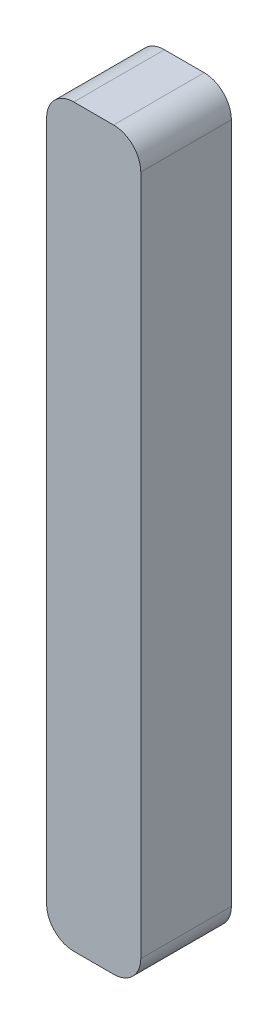
ISO-10303-21;
HEADER;
FILE_DESCRIPTION(('STEP AP214'),'2;1');
FILE_NAME('part.step','',(''),(''),'','','');
FILE_SCHEMA(('AUTOMOTIVE_DESIGN { 1 0 10303 214 1 1 1 1 }'));
ENDSEC;
DATA;
#1=APPLICATION_CONTEXT('core data for automotive mechanical design processes');
#2=APPLICATION_PROTOCOL_DEFINITION('international standard','automotive_design',2000,#1);
#3=PRODUCT_CONTEXT('',#1,'mechanical');
#4=PRODUCT('Part','Part','',(#3));
#5=PRODUCT_RELATED_PRODUCT_CATEGORY('part','',(#4));
#6=PRODUCT_DEFINITION_FORMATION('','',#4);
#7=PRODUCT_DEFINITION_CONTEXT('part definition',#1,'design');
#8=PRODUCT_DEFINITION('design','',#6,#7);
#9=PRODUCT_DEFINITION_SHAPE('','',#8);
#10=(LENGTH_UNIT() NAMED_UNIT(*) SI_UNIT(.MILLI.,.METRE.));
#11=(NAMED_UNIT(*) PLANE_ANGLE_UNIT() SI_UNIT($,.RADIAN.));
#12=(NAMED_UNIT(*) SI_UNIT($,.STERADIAN.) SOLID_ANGLE_UNIT());
#13=UNCERTAINTY_MEASURE_WITH_UNIT(LENGTH_MEASURE(1.E-05),#10,'distance_accuracy_value','');
#14=(GEOMETRIC_REPRESENTATION_CONTEXT(3) GLOBAL_UNCERTAINTY_ASSIGNED_CONTEXT((#13)) GLOBAL_UNIT_ASSIGNED_CONTEXT((#10,
#11,#12)) REPRESENTATION_CONTEXT('',''));
#15=CARTESIAN_POINT('',(0.,0.,0.));
#16=DIRECTION('',(0.,0.,1.));
#17=DIRECTION('',(1.,0.,0.));
#18=AXIS2_PLACEMENT_3D('',#15,#16,#17);
#19=CARTESIAN_POINT('',(-0.364922069394,-0.226124125005,0.));
#20=DIRECTION('',(0.,0.,1.));
#21=DIRECTION('',(1.,0.,0.));
#22=AXIS2_PLACEMENT_3D('',#19,#20,#21);
#23=PLANE('',#22);
#24=CARTESIAN_POINT('',(-0.342950473699,0.149841895363,0.));
#25=DIRECTION('',(0.,0.,1.));
#26=DIRECTION('',(0.707106781186548,0.707106781186548,0.));
#27=AXIS2_PLACEMENT_3D('',#24,#25,#26);
#28=CIRCLE('',#27,0.03);
#29=CARTESIAN_POINT('',(-0.312950473699,0.149841895363,0.));
#30=VERTEX_POINT('',#29);
#31=CARTESIAN_POINT('',(-0.342950473699,0.179841895363,0.));
#32=VERTEX_POINT('',#31);
#33=EDGE_CURVE('E165',#30,#32,#28,.T.);
#34=ORIENTED_EDGE('',*,*,#33,.F.);
#35=DIRECTION('',(0.,1.,0.));
#36=VECTOR('',#35,1.);
#37=CARTESIAN_POINT('',(-0.312950473699,-0.632090145373,0.));
#38=LINE('',#37,#36);
#39=CARTESIAN_POINT('',(-0.312950473699,-0.602090145373,0.));
#40=VERTEX_POINT('',#39);
#41=EDGE_CURVE('E11',#40,#30,#38,.T.);
#42=ORIENTED_EDGE('',*,*,#41,.F.);
#43=CARTESIAN_POINT('',(-0.342950473699,-0.602090145373,0.));
#44=DIRECTION('',(0.,0.,1.));
#45=DIRECTION('',(0.707106781186548,-0.707106781186548,0.));
#46=AXIS2_PLACEMENT_3D('',#43,#44,#45);
#47=CIRCLE('',#46,0.03);
#48=CARTESIAN_POINT('',(-0.342950473699,-0.632090145373,0.));
#49=VERTEX_POINT('',#48);
#50=EDGE_CURVE('E108',#49,#40,#47,.T.);
#51=ORIENTED_EDGE('',*,*,#50,.F.);
#52=DIRECTION('',(1.,0.,0.));
#53=VECTOR('',#52,1.);
#54=CARTESIAN_POINT('',(-0.416893665089,-0.632090145373,0.));
#55=LINE('',#54,#53);
#56=CARTESIAN_POINT('',(-0.386893665089,-0.632090145373,0.));
#57=VERTEX_POINT('',#56);
#58=EDGE_CURVE('E100',#57,#49,#55,.T.);
#59=ORIENTED_EDGE('',*,*,#58,.F.);
#60=CARTESIAN_POINT('',(-0.386893665089,-0.602090145373,0.));
#61=DIRECTION('',(0.,0.,1.));
#62=DIRECTION('',(-0.707106781186548,-0.707106781186548,0.));
#63=AXIS2_PLACEMENT_3D('',#60,#61,#62);
#64=CIRCLE('',#63,0.03);
#65=CARTESIAN_POINT('',(-0.416893665089,-0.602090145373,0.));
#66=VERTEX_POINT('',#65);
#67=EDGE_CURVE('E139',#66,#57,#64,.T.);
#68=ORIENTED_EDGE('',*,*,#67,.F.);
#69=DIRECTION('',(0.,-1.,0.));
#70=VECTOR('',#69,1.);
#71=CARTESIAN_POINT('',(-0.416893665089,0.179841895363,0.));
#72=LINE('',#71,#70);
#73=CARTESIAN_POINT('',(-0.416893665089,0.149841895363,0.));
#74=VERTEX_POINT('',#73);
#75=EDGE_CURVE('E27',#74,#66,#72,.T.);
#76=ORIENTED_EDGE('',*,*,#75,.F.);
#77=CARTESIAN_POINT('',(-0.386893665089,0.149841895363,0.));
#78=DIRECTION('',(0.,0.,1.));
#79=DIRECTION('',(-0.707106781186548,0.707106781186548,0.));
#80=AXIS2_PLACEMENT_3D('',#77,#78,#79);
#81=CIRCLE('',#80,0.03);
#82=CARTESIAN_POINT('',(-0.386893665089,0.179841895363,0.));
#83=VERTEX_POINT('',#82);
#84=EDGE_CURVE('E126',#83,#74,#81,.T.);
#85=ORIENTED_EDGE('',*,*,#84,.F.);
#86=DIRECTION('',(-1.,0.,0.));
#87=VECTOR('',#86,1.);
#88=CARTESIAN_POINT('',(-0.312950473699,0.179841895363,0.));
#89=LINE('',#88,#87);
#90=EDGE_CURVE('E20',#32,#83,#89,.T.);
#91=ORIENTED_EDGE('',*,*,#90,.F.);
#92=EDGE_LOOP('',(#34,#42,#51,#59,#68,#76,#85,#91));
#93=FACE_BOUND('',#92,.T.);
#94=ADVANCED_FACE('F16',(#93),#23,.F.);
#95=CARTESIAN_POINT('',(-0.312950473699,-0.632090145373,0.));
#96=DIRECTION('',(1.,0.,0.));
#97=DIRECTION('',(0.,1.,0.));
#98=AXIS2_PLACEMENT_3D('',#95,#96,#97);
#99=PLANE('',#98);
#100=DIRECTION('',(0.,0.,-1.));
#101=VECTOR('',#100,1.);
#102=CARTESIAN_POINT('',(-0.312950473699,0.149841895363,0.));
#103=LINE('',#102,#101);
#104=CARTESIAN_POINT('',(-0.312950473699,0.149841895363,0.1));
#105=VERTEX_POINT('',#104);
#106=EDGE_CURVE('E174',#105,#30,#103,.T.);
#107=ORIENTED_EDGE('',*,*,#106,.F.);
#108=DIRECTION('',(0.,1.,0.));
#109=VECTOR('',#108,1.);
#110=CARTESIAN_POINT('',(-0.312950473699,-0.632090145373,0.1));
#111=LINE('',#110,#109);
#112=CARTESIAN_POINT('',(-0.312950473699,-0.602090145373,0.1));
#113=VERTEX_POINT('',#112);
#114=EDGE_CURVE('E143',#113,#105,#111,.T.);
#115=ORIENTED_EDGE('',*,*,#114,.F.);
#116=DIRECTION('',(0.,0.,1.));
#117=VECTOR('',#116,1.);
#118=CARTESIAN_POINT('',(-0.312950473699,-0.602090145373,0.));
#119=LINE('',#118,#117);
#120=EDGE_CURVE('E113',#40,#113,#119,.T.);
#121=ORIENTED_EDGE('',*,*,#120,.F.);
#122=ORIENTED_EDGE('',*,*,#41,.T.);
#123=EDGE_LOOP('',(#107,#115,#121,#122));
#124=FACE_BOUND('',#123,.T.);
#125=ADVANCED_FACE('F221',(#124),#99,.T.);
#126=CARTESIAN_POINT('',(-0.416893665089,0.179841895363,0.));
#127=DIRECTION('',(-1.,0.,0.));
#128=DIRECTION('',(0.,1.,0.));
#129=AXIS2_PLACEMENT_3D('',#126,#127,#128);
#130=PLANE('',#129);
#131=DIRECTION('',(0.,0.,1.));
#132=VECTOR('',#131,1.);
#133=CARTESIAN_POINT('',(-0.416893665089,0.149841895363,0.));
#134=LINE('',#133,#132);
#135=CARTESIAN_POINT('',(-0.416893665089,0.149841895363,0.1));
#136=VERTEX_POINT('',#135);
#137=EDGE_CURVE('E120',#74,#136,#134,.T.);
#138=ORIENTED_EDGE('',*,*,#137,.F.);
#139=ORIENTED_EDGE('',*,*,#75,.T.);
#140=DIRECTION('',(0.,0.,-1.));
#141=VECTOR('',#140,1.);
#142=CARTESIAN_POINT('',(-0.416893665089,-0.602090145373,0.));
#143=LINE('',#142,#141);
#144=CARTESIAN_POINT('',(-0.416893665089,-0.602090145373,0.1));
#145=VERTEX_POINT('',#144);
#146=EDGE_CURVE('E105',#145,#66,#143,.T.);
#147=ORIENTED_EDGE('',*,*,#146,.F.);
#148=DIRECTION('',(0.,-1.,0.));
#149=VECTOR('',#148,1.);
#150=CARTESIAN_POINT('',(-0.416893665089,0.179841895363,0.1));
#151=LINE('',#150,#149);
#152=EDGE_CURVE('E162',#136,#145,#151,.T.);
#153=ORIENTED_EDGE('',*,*,#152,.F.);
#154=EDGE_LOOP('',(#138,#139,#147,#153));
#155=FACE_BOUND('',#154,.T.);
#156=ADVANCED_FACE('F18',(#155),#130,.T.);
#157=CARTESIAN_POINT('',(-0.386893665089,-0.602090145373,0.));
#158=DIRECTION('',(0.,0.,1.));
#159=DIRECTION('',(-0.707106781186548,-0.707106781186548,0.));
#160=AXIS2_PLACEMENT_3D('',#157,#158,#159);
#161=CYLINDRICAL_SURFACE('',#160,0.03);
#162=CARTESIAN_POINT('',(-0.386893665089,-0.602090145373,0.1));
#163=DIRECTION('',(0.,0.,-1.));
#164=DIRECTION('',(-0.707106781186548,-0.707106781186548,0.));
#165=AXIS2_PLACEMENT_3D('',#162,#163,#164);
#166=CIRCLE('',#165,0.03);
#167=CARTESIAN_POINT('',(-0.386893665089,-0.632090145373,0.1));
#168=VERTEX_POINT('',#167);
#169=EDGE_CURVE('E188',#168,#145,#166,.T.);
#170=ORIENTED_EDGE('',*,*,#169,.T.);
#171=ORIENTED_EDGE('',*,*,#146,.T.);
#172=ORIENTED_EDGE('',*,*,#67,.T.);
#173=DIRECTION('',(0.,0.,1.));
#174=VECTOR('',#173,1.);
#175=CARTESIAN_POINT('',(-0.386893665089,-0.632090145373,0.));
#176=LINE('',#175,#174);
#177=EDGE_CURVE('E95',#57,#168,#176,.T.);
#178=ORIENTED_EDGE('',*,*,#177,.T.);
#179=EDGE_LOOP('',(#170,#171,#172,#178));
#180=FACE_BOUND('',#179,.T.);
#181=ADVANCED_FACE('F202',(#180),#161,.T.);
#182=CARTESIAN_POINT('',(-0.416893665089,-0.632090145373,0.));
#183=DIRECTION('',(0.,-1.,0.));
#184=DIRECTION('',(0.,0.,-1.));
#185=AXIS2_PLACEMENT_3D('',#182,#183,#184);
#186=PLANE('',#185);
#187=DIRECTION('',(0.,0.,-1.));
#188=VECTOR('',#187,1.);
#189=CARTESIAN_POINT('',(-0.342950473699,-0.632090145373,0.));
#190=LINE('',#189,#188);
#191=CARTESIAN_POINT('',(-0.342950473699,-0.632090145373,0.1));
#192=VERTEX_POINT('',#191);
#193=EDGE_CURVE('E84',#192,#49,#190,.T.);
#194=ORIENTED_EDGE('',*,*,#193,.F.);
#195=DIRECTION('',(1.,0.,0.));
#196=VECTOR('',#195,1.);
#197=CARTESIAN_POINT('',(-0.416893665089,-0.632090145373,0.1));
#198=LINE('',#197,#196);
#199=EDGE_CURVE('E144',#168,#192,#198,.T.);
#200=ORIENTED_EDGE('',*,*,#199,.F.);
#201=ORIENTED_EDGE('',*,*,#177,.F.);
#202=ORIENTED_EDGE('',*,*,#58,.T.);
#203=EDGE_LOOP('',(#194,#200,#201,#202));
#204=FACE_BOUND('',#203,.T.);
#205=ADVANCED_FACE('F102',(#204),#186,.T.);
#206=CARTESIAN_POINT('',(-0.342950473699,-0.602090145373,0.));
#207=DIRECTION('',(0.,0.,1.));
#208=DIRECTION('',(0.707106781186548,-0.707106781186548,0.));
#209=AXIS2_PLACEMENT_3D('',#206,#207,#208);
#210=CYLINDRICAL_SURFACE('',#209,0.03);
#211=CARTESIAN_POINT('',(-0.342950473699,-0.602090145373,0.1));
#212=DIRECTION('',(0.,0.,-1.));
#213=DIRECTION('',(0.707106781186548,-0.707106781186548,0.));
#214=AXIS2_PLACEMENT_3D('',#211,#212,#213);
#215=CIRCLE('',#214,0.03);
#216=EDGE_CURVE('E117',#113,#192,#215,.T.);
#217=ORIENTED_EDGE('',*,*,#216,.T.);
#218=ORIENTED_EDGE('',*,*,#193,.T.);
#219=ORIENTED_EDGE('',*,*,#50,.T.);
#220=ORIENTED_EDGE('',*,*,#120,.T.);
#221=EDGE_LOOP('',(#217,#218,#219,#220));
#222=FACE_BOUND('',#221,.T.);
#223=ADVANCED_FACE('F115',(#222),#210,.T.);
#224=CARTESIAN_POINT('',(-0.386893665089,0.149841895363,0.));
#225=DIRECTION('',(0.,0.,1.));
#226=DIRECTION('',(-0.707106781186548,0.707106781186548,0.));
#227=AXIS2_PLACEMENT_3D('',#224,#225,#226);
#228=CYLINDRICAL_SURFACE('',#227,0.03);
#229=CARTESIAN_POINT('',(-0.386893665089,0.149841895363,0.1));
#230=DIRECTION('',(0.,0.,-1.));
#231=DIRECTION('',(-0.707106781186548,0.707106781186548,0.));
#232=AXIS2_PLACEMENT_3D('',#229,#230,#231);
#233=CIRCLE('',#232,0.03);
#234=CARTESIAN_POINT('',(-0.386893665089,0.179841895363,0.1));
#235=VERTEX_POINT('',#234);
#236=EDGE_CURVE('E151',#136,#235,#233,.T.);
#237=ORIENTED_EDGE('',*,*,#236,.T.);
#238=DIRECTION('',(0.,0.,-1.));
#239=VECTOR('',#238,1.);
#240=CARTESIAN_POINT('',(-0.386893665089,0.179841895363,0.));
#241=LINE('',#240,#239);
#242=EDGE_CURVE('E147',#235,#83,#241,.T.);
#243=ORIENTED_EDGE('',*,*,#242,.T.);
#244=ORIENTED_EDGE('',*,*,#84,.T.);
#245=ORIENTED_EDGE('',*,*,#137,.T.);
#246=EDGE_LOOP('',(#237,#243,#244,#245));
#247=FACE_BOUND('',#246,.T.);
#248=ADVANCED_FACE('F204',(#247),#228,.T.);
#249=CARTESIAN_POINT('',(-0.312950473699,0.179841895363,0.));
#250=DIRECTION('',(0.,1.,0.));
#251=DIRECTION('',(1.,0.,0.));
#252=AXIS2_PLACEMENT_3D('',#249,#250,#251);
#253=PLANE('',#252);
#254=DIRECTION('',(0.,0.,1.));
#255=VECTOR('',#254,1.);
#256=CARTESIAN_POINT('',(-0.342950473699,0.179841895363,0.));
#257=LINE('',#256,#255);
#258=CARTESIAN_POINT('',(-0.342950473699,0.179841895363,0.1));
#259=VERTEX_POINT('',#258);
#260=EDGE_CURVE('E152',#32,#259,#257,.T.);
#261=ORIENTED_EDGE('',*,*,#260,.F.);
#262=ORIENTED_EDGE('',*,*,#90,.T.);
#263=ORIENTED_EDGE('',*,*,#242,.F.);
#264=DIRECTION('',(-1.,0.,0.));
#265=VECTOR('',#264,1.);
#266=CARTESIAN_POINT('',(-0.312950473699,0.179841895363,0.1));
#267=LINE('',#266,#265);
#268=EDGE_CURVE('E148',#259,#235,#267,.T.);
#269=ORIENTED_EDGE('',*,*,#268,.F.);
#270=EDGE_LOOP('',(#261,#262,#263,#269));
#271=FACE_BOUND('',#270,.T.);
#272=ADVANCED_FACE('F266',(#271),#253,.T.);
#273=CARTESIAN_POINT('',(-0.364922069394,-0.226124125005,0.1));
#274=DIRECTION('',(0.,0.,1.));
#275=DIRECTION('',(1.,0.,0.));
#276=AXIS2_PLACEMENT_3D('',#273,#274,#275);
#277=PLANE('',#276);
#278=CARTESIAN_POINT('',(-0.342950473699,0.149841895363,0.1));
#279=DIRECTION('',(0.,0.,-1.));
#280=DIRECTION('',(0.707106781186548,0.707106781186548,0.));
#281=AXIS2_PLACEMENT_3D('',#278,#279,#280);
#282=CIRCLE('',#281,0.03);
#283=EDGE_CURVE('E177',#259,#105,#282,.T.);
#284=ORIENTED_EDGE('',*,*,#283,.F.);
#285=ORIENTED_EDGE('',*,*,#268,.T.);
#286=ORIENTED_EDGE('',*,*,#236,.F.);
#287=ORIENTED_EDGE('',*,*,#152,.T.);
#288=ORIENTED_EDGE('',*,*,#169,.F.);
#289=ORIENTED_EDGE('',*,*,#199,.T.);
#290=ORIENTED_EDGE('',*,*,#216,.F.);
#291=ORIENTED_EDGE('',*,*,#114,.T.);
#292=EDGE_LOOP('',(#284,#285,#286,#287,#288,#289,#290,#291));
#293=FACE_BOUND('',#292,.T.);
#294=ADVANCED_FACE('F200',(#293),#277,.T.);
#295=CARTESIAN_POINT('',(-0.342950473699,0.149841895363,0.));
#296=DIRECTION('',(0.,0.,1.));
#297=DIRECTION('',(0.707106781186548,0.707106781186548,0.));
#298=AXIS2_PLACEMENT_3D('',#295,#296,#297);
#299=CYLINDRICAL_SURFACE('',#298,0.03);
#300=ORIENTED_EDGE('',*,*,#283,.T.);
#301=ORIENTED_EDGE('',*,*,#106,.T.);
#302=ORIENTED_EDGE('',*,*,#33,.T.);
#303=ORIENTED_EDGE('',*,*,#260,.T.);
#304=EDGE_LOOP('',(#300,#301,#302,#303));
#305=FACE_BOUND('',#304,.T.);
#306=ADVANCED_FACE('F233',(#305),#299,.T.);
#307=CLOSED_SHELL('',(#94,#125,#156,#181,#205,#223,#248,#272,#294,#306));
#308=MANIFOLD_SOLID_BREP('B1',#307);
#309=ADVANCED_BREP_SHAPE_REPRESENTATION('',(#18,#308),#14);
#310=SHAPE_DEFINITION_REPRESENTATION(#9,#309);
ENDSEC;
END-ISO-10303-21;
